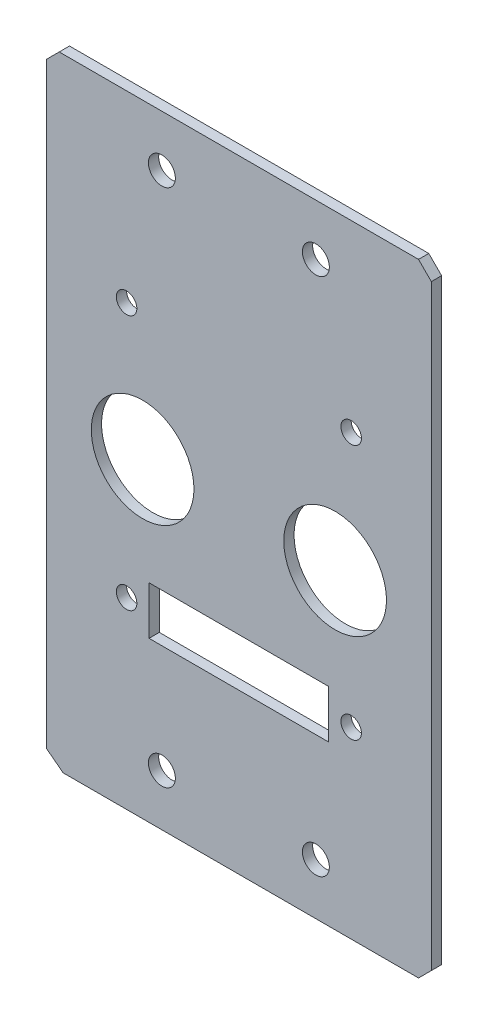
ISO-10303-21;
HEADER;
FILE_DESCRIPTION(('STEP AP214'),'2;1');
FILE_NAME('part.step','',(''),(''),'','','');
FILE_SCHEMA(('AUTOMOTIVE_DESIGN { 1 0 10303 214 1 1 1 1 }'));
ENDSEC;
DATA;
#1=APPLICATION_CONTEXT('core data for automotive mechanical design processes');
#2=APPLICATION_PROTOCOL_DEFINITION('international standard','automotive_design',2000,#1);
#3=PRODUCT_CONTEXT('',#1,'mechanical');
#4=PRODUCT('Part','Part','',(#3));
#5=PRODUCT_RELATED_PRODUCT_CATEGORY('part','',(#4));
#6=PRODUCT_DEFINITION_FORMATION('','',#4);
#7=PRODUCT_DEFINITION_CONTEXT('part definition',#1,'design');
#8=PRODUCT_DEFINITION('design','',#6,#7);
#9=PRODUCT_DEFINITION_SHAPE('','',#8);
#10=(LENGTH_UNIT() NAMED_UNIT(*) SI_UNIT(.MILLI.,.METRE.));
#11=(NAMED_UNIT(*) PLANE_ANGLE_UNIT() SI_UNIT($,.RADIAN.));
#12=(NAMED_UNIT(*) SI_UNIT($,.STERADIAN.) SOLID_ANGLE_UNIT());
#13=UNCERTAINTY_MEASURE_WITH_UNIT(LENGTH_MEASURE(1.E-05),#10,'distance_accuracy_value','');
#14=(GEOMETRIC_REPRESENTATION_CONTEXT(3) GLOBAL_UNCERTAINTY_ASSIGNED_CONTEXT((#13)) GLOBAL_UNIT_ASSIGNED_CONTEXT((#10,
#11,#12)) REPRESENTATION_CONTEXT('',''));
#15=CARTESIAN_POINT('',(0.,0.,0.));
#16=DIRECTION('',(0.,0.,1.));
#17=DIRECTION('',(1.,0.,0.));
#18=AXIS2_PLACEMENT_3D('',#15,#16,#17);
#19=CARTESIAN_POINT('',(1.07552855510562E-13,76.5000000000001,1.6));
#20=DIRECTION('',(0.,0.,-1.));
#21=DIRECTION('',(-1.,0.,0.));
#22=AXIS2_PLACEMENT_3D('',#19,#20,#21);
#23=PLANE('',#22);
#24=CARTESIAN_POINT('',(15.,0.,1.6));
#25=DIRECTION('',(0.,0.,1.));
#26=DIRECTION('',(-1.,0.,0.));
#27=AXIS2_PLACEMENT_3D('',#24,#25,#26);
#28=CIRCLE('',#27,8.);
#29=CARTESIAN_POINT('',(7.,0.,1.6));
#30=VERTEX_POINT('',#29);
#31=EDGE_CURVE('E160',#30,#30,#28,.T.);
#32=ORIENTED_EDGE('',*,*,#31,.F.);
#33=EDGE_LOOP('',(#32));
#34=FACE_BOUND('',#33,.T.);
#35=CARTESIAN_POINT('',(12.,-40.5,1.6));
#36=DIRECTION('',(0.,0.,1.));
#37=DIRECTION('',(1.,0.,0.));
#38=AXIS2_PLACEMENT_3D('',#35,#36,#37);
#39=CIRCLE('',#38,2.1);
#40=CARTESIAN_POINT('',(14.1,-40.5,1.6));
#41=VERTEX_POINT('',#40);
#42=EDGE_CURVE('E172',#41,#41,#39,.T.);
#43=ORIENTED_EDGE('',*,*,#42,.F.);
#44=EDGE_LOOP('',(#43));
#45=FACE_BOUND('',#44,.T.);
#46=CARTESIAN_POINT('',(17.5,19.9,1.6));
#47=DIRECTION('',(0.,0.,1.));
#48=DIRECTION('',(-1.,0.,0.));
#49=AXIS2_PLACEMENT_3D('',#46,#47,#48);
#50=CIRCLE('',#49,1.6);
#51=CARTESIAN_POINT('',(15.9,19.9,1.6));
#52=VERTEX_POINT('',#51);
#53=EDGE_CURVE('E184',#52,#52,#50,.T.);
#54=ORIENTED_EDGE('',*,*,#53,.F.);
#55=EDGE_LOOP('',(#54));
#56=FACE_BOUND('',#55,.T.);
#57=CARTESIAN_POINT('',(-17.5,-19.9,1.6));
#58=DIRECTION('',(0.,0.,1.));
#59=DIRECTION('',(-1.,0.,0.));
#60=AXIS2_PLACEMENT_3D('',#57,#58,#59);
#61=CIRCLE('',#60,1.6);
#62=CARTESIAN_POINT('',(-19.1,-19.9,1.6));
#63=VERTEX_POINT('',#62);
#64=EDGE_CURVE('E196',#63,#63,#61,.T.);
#65=ORIENTED_EDGE('',*,*,#64,.F.);
#66=EDGE_LOOP('',(#65));
#67=FACE_BOUND('',#66,.T.);
#68=CARTESIAN_POINT('',(-17.5,19.9,1.6));
#69=DIRECTION('',(0.,0.,1.));
#70=DIRECTION('',(1.,0.,0.));
#71=AXIS2_PLACEMENT_3D('',#68,#69,#70);
#72=CIRCLE('',#71,1.6);
#73=CARTESIAN_POINT('',(-15.9,19.9,1.6));
#74=VERTEX_POINT('',#73);
#75=EDGE_CURVE('E208',#74,#74,#72,.T.);
#76=ORIENTED_EDGE('',*,*,#75,.F.);
#77=EDGE_LOOP('',(#76));
#78=FACE_BOUND('',#77,.T.);
#79=DIRECTION('',(-0.707106781186548,-0.707106781186548,0.));
#80=VECTOR('',#79,1.);
#81=CARTESIAN_POINT('',(-30.,46.5,1.6));
#82=LINE('',#81,#80);
#83=CARTESIAN_POINT('',(-28.,48.5,1.6));
#84=VERTEX_POINT('',#83);
#85=CARTESIAN_POINT('',(-30.,46.5,1.6));
#86=VERTEX_POINT('',#85);
#87=EDGE_CURVE('E220',#84,#86,#82,.T.);
#88=ORIENTED_EDGE('',*,*,#87,.T.);
#89=DIRECTION('',(0.,-1.,0.));
#90=VECTOR('',#89,1.);
#91=CARTESIAN_POINT('',(-30.,46.5,1.6));
#92=LINE('',#91,#90);
#93=CARTESIAN_POINT('',(-30.,-46.5,1.6));
#94=VERTEX_POINT('',#93);
#95=EDGE_CURVE('E223',#86,#94,#92,.T.);
#96=ORIENTED_EDGE('',*,*,#95,.T.);
#97=DIRECTION('',(0.793797531827284,-0.608182109622531,0.));
#98=VECTOR('',#97,1.);
#99=CARTESIAN_POINT('',(-30.,-46.5,1.6));
#100=LINE('',#99,#98);
#101=CARTESIAN_POINT('',(-27.3896057800189,-48.5,1.6));
#102=VERTEX_POINT('',#101);
#103=EDGE_CURVE('E226',#94,#102,#100,.T.);
#104=ORIENTED_EDGE('',*,*,#103,.T.);
#105=DIRECTION('',(1.,0.,0.));
#106=VECTOR('',#105,1.);
#107=CARTESIAN_POINT('',(-27.3896057800189,-48.5,1.6));
#108=LINE('',#107,#106);
#109=CARTESIAN_POINT('',(28.,-48.5,1.6));
#110=VERTEX_POINT('',#109);
#111=EDGE_CURVE('E228',#102,#110,#108,.T.);
#112=ORIENTED_EDGE('',*,*,#111,.T.);
#113=DIRECTION('',(0.707106781186548,0.707106781186548,0.));
#114=VECTOR('',#113,1.);
#115=CARTESIAN_POINT('',(28.,-48.5,1.6));
#116=LINE('',#115,#114);
#117=CARTESIAN_POINT('',(30.,-46.5,1.6));
#118=VERTEX_POINT('',#117);
#119=EDGE_CURVE('E230',#110,#118,#116,.T.);
#120=ORIENTED_EDGE('',*,*,#119,.T.);
#121=DIRECTION('',(0.,1.,0.));
#122=VECTOR('',#121,1.);
#123=CARTESIAN_POINT('',(30.,46.5,1.6));
#124=LINE('',#123,#122);
#125=CARTESIAN_POINT('',(30.,46.5,1.6));
#126=VERTEX_POINT('',#125);
#127=EDGE_CURVE('E232',#118,#126,#124,.T.);
#128=ORIENTED_EDGE('',*,*,#127,.T.);
#129=DIRECTION('',(-0.707106781186545,0.70710678118655,0.));
#130=VECTOR('',#129,1.);
#131=CARTESIAN_POINT('',(28.,48.5,1.6));
#132=LINE('',#131,#130);
#133=CARTESIAN_POINT('',(28.,48.5,1.6));
#134=VERTEX_POINT('',#133);
#135=EDGE_CURVE('E234',#126,#134,#132,.T.);
#136=ORIENTED_EDGE('',*,*,#135,.T.);
#137=DIRECTION('',(-1.,0.,0.));
#138=VECTOR('',#137,1.);
#139=CARTESIAN_POINT('',(-28.,48.5,1.6));
#140=LINE('',#139,#138);
#141=EDGE_CURVE('E236',#134,#84,#140,.T.);
#142=ORIENTED_EDGE('',*,*,#141,.T.);
#143=EDGE_LOOP('',(#88,#96,#104,#112,#120,#128,#136,#142));
#144=FACE_BOUND('',#143,.T.);
#145=CARTESIAN_POINT('',(-15.,0.,1.6));
#146=DIRECTION('',(0.,0.,1.));
#147=DIRECTION('',(1.,0.,0.));
#148=AXIS2_PLACEMENT_3D('',#145,#146,#147);
#149=CIRCLE('',#148,8.);
#150=CARTESIAN_POINT('',(-6.99999999999999,0.,1.6));
#151=VERTEX_POINT('',#150);
#152=EDGE_CURVE('E214',#151,#151,#149,.T.);
#153=ORIENTED_EDGE('',*,*,#152,.F.);
#154=EDGE_LOOP('',(#153));
#155=FACE_BOUND('',#154,.T.);
#156=CARTESIAN_POINT('',(-12.,40.5,1.6));
#157=DIRECTION('',(0.,0.,1.));
#158=DIRECTION('',(1.,0.,0.));
#159=AXIS2_PLACEMENT_3D('',#156,#157,#158);
#160=CIRCLE('',#159,2.1);
#161=CARTESIAN_POINT('',(-9.9,40.5,1.6));
#162=VERTEX_POINT('',#161);
#163=EDGE_CURVE('E202',#162,#162,#160,.T.);
#164=ORIENTED_EDGE('',*,*,#163,.F.);
#165=EDGE_LOOP('',(#164));
#166=FACE_BOUND('',#165,.T.);
#167=CARTESIAN_POINT('',(-12.,-40.5,1.6));
#168=DIRECTION('',(0.,0.,1.));
#169=DIRECTION('',(-1.,0.,0.));
#170=AXIS2_PLACEMENT_3D('',#167,#168,#169);
#171=CIRCLE('',#170,2.1);
#172=CARTESIAN_POINT('',(-14.1,-40.5,1.6));
#173=VERTEX_POINT('',#172);
#174=EDGE_CURVE('E190',#173,#173,#171,.T.);
#175=ORIENTED_EDGE('',*,*,#174,.F.);
#176=EDGE_LOOP('',(#175));
#177=FACE_BOUND('',#176,.T.);
#178=CARTESIAN_POINT('',(12.,40.5,1.6));
#179=DIRECTION('',(0.,0.,1.));
#180=DIRECTION('',(-1.,0.,0.));
#181=AXIS2_PLACEMENT_3D('',#178,#179,#180);
#182=CIRCLE('',#181,2.1);
#183=CARTESIAN_POINT('',(9.90000000000003,40.5,1.6));
#184=VERTEX_POINT('',#183);
#185=EDGE_CURVE('E178',#184,#184,#182,.T.);
#186=ORIENTED_EDGE('',*,*,#185,.F.);
#187=EDGE_LOOP('',(#186));
#188=FACE_BOUND('',#187,.T.);
#189=CARTESIAN_POINT('',(17.5,-19.9,1.6));
#190=DIRECTION('',(0.,0.,1.));
#191=DIRECTION('',(1.,0.,0.));
#192=AXIS2_PLACEMENT_3D('',#189,#190,#191);
#193=CIRCLE('',#192,1.6);
#194=CARTESIAN_POINT('',(19.1,-19.9,1.6));
#195=VERTEX_POINT('',#194);
#196=EDGE_CURVE('E166',#195,#195,#193,.T.);
#197=ORIENTED_EDGE('',*,*,#196,.F.);
#198=EDGE_LOOP('',(#197));
#199=FACE_BOUND('',#198,.T.);
#200=DIRECTION('',(0.,-1.,0.));
#201=VECTOR('',#200,1.);
#202=CARTESIAN_POINT('',(-14.,-16.15,1.6));
#203=LINE('',#202,#201);
#204=CARTESIAN_POINT('',(-14.,-16.15,1.6));
#205=VERTEX_POINT('',#204);
#206=CARTESIAN_POINT('',(-14.,-23.65,1.6));
#207=VERTEX_POINT('',#206);
#208=EDGE_CURVE('E124',#205,#207,#203,.T.);
#209=ORIENTED_EDGE('',*,*,#208,.F.);
#210=DIRECTION('',(-1.,0.,0.));
#211=VECTOR('',#210,1.);
#212=CARTESIAN_POINT('',(-14.,-16.15,1.6));
#213=LINE('',#212,#211);
#214=CARTESIAN_POINT('',(14.,-16.15,1.6));
#215=VERTEX_POINT('',#214);
#216=EDGE_CURVE('E146',#215,#205,#213,.T.);
#217=ORIENTED_EDGE('',*,*,#216,.F.);
#218=DIRECTION('',(0.,1.,0.));
#219=VECTOR('',#218,1.);
#220=CARTESIAN_POINT('',(14.,-16.15,1.6));
#221=LINE('',#220,#219);
#222=CARTESIAN_POINT('',(14.,-23.65,1.6));
#223=VERTEX_POINT('',#222);
#224=EDGE_CURVE('E144',#223,#215,#221,.T.);
#225=ORIENTED_EDGE('',*,*,#224,.F.);
#226=DIRECTION('',(1.,0.,0.));
#227=VECTOR('',#226,1.);
#228=CARTESIAN_POINT('',(-14.,-23.65,1.6));
#229=LINE('',#228,#227);
#230=EDGE_CURVE('E132',#207,#223,#229,.T.);
#231=ORIENTED_EDGE('',*,*,#230,.F.);
#232=EDGE_LOOP('',(#209,#217,#225,#231));
#233=FACE_BOUND('',#232,.T.);
#234=ADVANCED_FACE('F35',(#34,#45,#56,#67,#78,#144,#155,#166,#177,#188,#199,#233),#23,.F.);
#235=CARTESIAN_POINT('',(1.07552855510562E-13,76.5000000000001,0.));
#236=DIRECTION('',(0.,0.,-1.));
#237=DIRECTION('',(-1.,0.,0.));
#238=AXIS2_PLACEMENT_3D('',#235,#236,#237);
#239=PLANE('',#238);
#240=CARTESIAN_POINT('',(15.,0.,0.));
#241=DIRECTION('',(0.,0.,1.));
#242=DIRECTION('',(-1.,0.,0.));
#243=AXIS2_PLACEMENT_3D('',#240,#241,#242);
#244=CIRCLE('',#243,8.);
#245=CARTESIAN_POINT('',(7.,0.,0.));
#246=VERTEX_POINT('',#245);
#247=EDGE_CURVE('E140',#246,#246,#244,.T.);
#248=ORIENTED_EDGE('',*,*,#247,.T.);
#249=EDGE_LOOP('',(#248));
#250=FACE_BOUND('',#249,.T.);
#251=CARTESIAN_POINT('',(12.,-40.5,0.));
#252=DIRECTION('',(0.,0.,1.));
#253=DIRECTION('',(1.,0.,0.));
#254=AXIS2_PLACEMENT_3D('',#251,#252,#253);
#255=CIRCLE('',#254,2.1);
#256=CARTESIAN_POINT('',(14.1,-40.5,0.));
#257=VERTEX_POINT('',#256);
#258=EDGE_CURVE('E169',#257,#257,#255,.T.);
#259=ORIENTED_EDGE('',*,*,#258,.T.);
#260=EDGE_LOOP('',(#259));
#261=FACE_BOUND('',#260,.T.);
#262=CARTESIAN_POINT('',(17.5,19.9,0.));
#263=DIRECTION('',(0.,0.,1.));
#264=DIRECTION('',(-1.,0.,0.));
#265=AXIS2_PLACEMENT_3D('',#262,#263,#264);
#266=CIRCLE('',#265,1.6);
#267=CARTESIAN_POINT('',(15.9,19.9,0.));
#268=VERTEX_POINT('',#267);
#269=EDGE_CURVE('E181',#268,#268,#266,.T.);
#270=ORIENTED_EDGE('',*,*,#269,.T.);
#271=EDGE_LOOP('',(#270));
#272=FACE_BOUND('',#271,.T.);
#273=CARTESIAN_POINT('',(-17.5,-19.9,0.));
#274=DIRECTION('',(0.,0.,1.));
#275=DIRECTION('',(-1.,0.,0.));
#276=AXIS2_PLACEMENT_3D('',#273,#274,#275);
#277=CIRCLE('',#276,1.6);
#278=CARTESIAN_POINT('',(-19.1,-19.9,0.));
#279=VERTEX_POINT('',#278);
#280=EDGE_CURVE('E193',#279,#279,#277,.T.);
#281=ORIENTED_EDGE('',*,*,#280,.T.);
#282=EDGE_LOOP('',(#281));
#283=FACE_BOUND('',#282,.T.);
#284=CARTESIAN_POINT('',(-17.5,19.9,0.));
#285=DIRECTION('',(0.,0.,1.));
#286=DIRECTION('',(1.,0.,0.));
#287=AXIS2_PLACEMENT_3D('',#284,#285,#286);
#288=CIRCLE('',#287,1.6);
#289=CARTESIAN_POINT('',(-15.9,19.9,0.));
#290=VERTEX_POINT('',#289);
#291=EDGE_CURVE('E205',#290,#290,#288,.T.);
#292=ORIENTED_EDGE('',*,*,#291,.T.);
#293=EDGE_LOOP('',(#292));
#294=FACE_BOUND('',#293,.T.);
#295=DIRECTION('',(-0.707106781186548,-0.707106781186548,0.));
#296=VECTOR('',#295,1.);
#297=CARTESIAN_POINT('',(-30.,46.5,0.));
#298=LINE('',#297,#296);
#299=CARTESIAN_POINT('',(-28.,48.5,0.));
#300=VERTEX_POINT('',#299);
#301=CARTESIAN_POINT('',(-30.,46.5,0.));
#302=VERTEX_POINT('',#301);
#303=EDGE_CURVE('E217',#300,#302,#298,.T.);
#304=ORIENTED_EDGE('',*,*,#303,.F.);
#305=DIRECTION('',(-1.,0.,0.));
#306=VECTOR('',#305,1.);
#307=CARTESIAN_POINT('',(-28.,48.5,0.));
#308=LINE('',#307,#306);
#309=CARTESIAN_POINT('',(28.,48.5,0.));
#310=VERTEX_POINT('',#309);
#311=EDGE_CURVE('E224',#310,#300,#308,.T.);
#312=ORIENTED_EDGE('',*,*,#311,.F.);
#313=DIRECTION('',(-0.707106781186545,0.70710678118655,0.));
#314=VECTOR('',#313,1.);
#315=CARTESIAN_POINT('',(28.,48.5,0.));
#316=LINE('',#315,#314);
#317=CARTESIAN_POINT('',(30.,46.5,0.));
#318=VERTEX_POINT('',#317);
#319=EDGE_CURVE('E251',#318,#310,#316,.T.);
#320=ORIENTED_EDGE('',*,*,#319,.F.);
#321=DIRECTION('',(0.,1.,0.));
#322=VECTOR('',#321,1.);
#323=CARTESIAN_POINT('',(30.,46.5,0.));
#324=LINE('',#323,#322);
#325=CARTESIAN_POINT('',(30.,-46.5,0.));
#326=VERTEX_POINT('',#325);
#327=EDGE_CURVE('E249',#326,#318,#324,.T.);
#328=ORIENTED_EDGE('',*,*,#327,.F.);
#329=DIRECTION('',(0.707106781186548,0.707106781186548,0.));
#330=VECTOR('',#329,1.);
#331=CARTESIAN_POINT('',(28.,-48.5,0.));
#332=LINE('',#331,#330);
#333=CARTESIAN_POINT('',(28.,-48.5,0.));
#334=VERTEX_POINT('',#333);
#335=EDGE_CURVE('E247',#334,#326,#332,.T.);
#336=ORIENTED_EDGE('',*,*,#335,.F.);
#337=DIRECTION('',(1.,0.,0.));
#338=VECTOR('',#337,1.);
#339=CARTESIAN_POINT('',(-27.3896057800189,-48.5,0.));
#340=LINE('',#339,#338);
#341=CARTESIAN_POINT('',(-27.3896057800189,-48.5,0.));
#342=VERTEX_POINT('',#341);
#343=EDGE_CURVE('E245',#342,#334,#340,.T.);
#344=ORIENTED_EDGE('',*,*,#343,.F.);
#345=DIRECTION('',(0.793797531827284,-0.608182109622531,0.));
#346=VECTOR('',#345,1.);
#347=CARTESIAN_POINT('',(-30.,-46.5,0.));
#348=LINE('',#347,#346);
#349=CARTESIAN_POINT('',(-30.,-46.5,0.));
#350=VERTEX_POINT('',#349);
#351=EDGE_CURVE('E243',#350,#342,#348,.T.);
#352=ORIENTED_EDGE('',*,*,#351,.F.);
#353=DIRECTION('',(0.,-1.,0.));
#354=VECTOR('',#353,1.);
#355=CARTESIAN_POINT('',(-30.,46.5,0.));
#356=LINE('',#355,#354);
#357=EDGE_CURVE('E241',#302,#350,#356,.T.);
#358=ORIENTED_EDGE('',*,*,#357,.F.);
#359=EDGE_LOOP('',(#304,#312,#320,#328,#336,#344,#352,#358));
#360=FACE_BOUND('',#359,.T.);
#361=CARTESIAN_POINT('',(-15.,0.,0.));
#362=DIRECTION('',(0.,0.,1.));
#363=DIRECTION('',(1.,0.,0.));
#364=AXIS2_PLACEMENT_3D('',#361,#362,#363);
#365=CIRCLE('',#364,8.);
#366=CARTESIAN_POINT('',(-6.99999999999999,0.,0.));
#367=VERTEX_POINT('',#366);
#368=EDGE_CURVE('E211',#367,#367,#365,.T.);
#369=ORIENTED_EDGE('',*,*,#368,.T.);
#370=EDGE_LOOP('',(#369));
#371=FACE_BOUND('',#370,.T.);
#372=CARTESIAN_POINT('',(-12.,40.5,0.));
#373=DIRECTION('',(0.,0.,1.));
#374=DIRECTION('',(1.,0.,0.));
#375=AXIS2_PLACEMENT_3D('',#372,#373,#374);
#376=CIRCLE('',#375,2.1);
#377=CARTESIAN_POINT('',(-9.9,40.5,0.));
#378=VERTEX_POINT('',#377);
#379=EDGE_CURVE('E199',#378,#378,#376,.T.);
#380=ORIENTED_EDGE('',*,*,#379,.T.);
#381=EDGE_LOOP('',(#380));
#382=FACE_BOUND('',#381,.T.);
#383=CARTESIAN_POINT('',(-12.,-40.5,0.));
#384=DIRECTION('',(0.,0.,1.));
#385=DIRECTION('',(-1.,0.,0.));
#386=AXIS2_PLACEMENT_3D('',#383,#384,#385);
#387=CIRCLE('',#386,2.1);
#388=CARTESIAN_POINT('',(-14.1,-40.5,0.));
#389=VERTEX_POINT('',#388);
#390=EDGE_CURVE('E187',#389,#389,#387,.T.);
#391=ORIENTED_EDGE('',*,*,#390,.T.);
#392=EDGE_LOOP('',(#391));
#393=FACE_BOUND('',#392,.T.);
#394=CARTESIAN_POINT('',(12.,40.5,0.));
#395=DIRECTION('',(0.,0.,1.));
#396=DIRECTION('',(-1.,0.,0.));
#397=AXIS2_PLACEMENT_3D('',#394,#395,#396);
#398=CIRCLE('',#397,2.1);
#399=CARTESIAN_POINT('',(9.90000000000003,40.5,0.));
#400=VERTEX_POINT('',#399);
#401=EDGE_CURVE('E175',#400,#400,#398,.T.);
#402=ORIENTED_EDGE('',*,*,#401,.T.);
#403=EDGE_LOOP('',(#402));
#404=FACE_BOUND('',#403,.T.);
#405=CARTESIAN_POINT('',(17.5,-19.9,0.));
#406=DIRECTION('',(0.,0.,1.));
#407=DIRECTION('',(1.,0.,0.));
#408=AXIS2_PLACEMENT_3D('',#405,#406,#407);
#409=CIRCLE('',#408,1.6);
#410=CARTESIAN_POINT('',(19.1,-19.9,0.));
#411=VERTEX_POINT('',#410);
#412=EDGE_CURVE('E163',#411,#411,#409,.T.);
#413=ORIENTED_EDGE('',*,*,#412,.T.);
#414=EDGE_LOOP('',(#413));
#415=FACE_BOUND('',#414,.T.);
#416=DIRECTION('',(-1.,0.,0.));
#417=VECTOR('',#416,1.);
#418=CARTESIAN_POINT('',(-14.,-16.15,0.));
#419=LINE('',#418,#417);
#420=CARTESIAN_POINT('',(14.,-16.15,0.));
#421=VERTEX_POINT('',#420);
#422=CARTESIAN_POINT('',(-14.,-16.15,0.));
#423=VERTEX_POINT('',#422);
#424=EDGE_CURVE('E133',#421,#423,#419,.T.);
#425=ORIENTED_EDGE('',*,*,#424,.T.);
#426=DIRECTION('',(0.,-1.,0.));
#427=VECTOR('',#426,1.);
#428=CARTESIAN_POINT('',(-14.,-16.15,0.));
#429=LINE('',#428,#427);
#430=CARTESIAN_POINT('',(-14.,-23.65,0.));
#431=VERTEX_POINT('',#430);
#432=EDGE_CURVE('E58',#423,#431,#429,.T.);
#433=ORIENTED_EDGE('',*,*,#432,.T.);
#434=DIRECTION('',(1.,0.,0.));
#435=VECTOR('',#434,1.);
#436=CARTESIAN_POINT('',(-14.,-23.65,0.));
#437=LINE('',#436,#435);
#438=CARTESIAN_POINT('',(14.,-23.65,0.));
#439=VERTEX_POINT('',#438);
#440=EDGE_CURVE('E139',#431,#439,#437,.T.);
#441=ORIENTED_EDGE('',*,*,#440,.T.);
#442=DIRECTION('',(0.,1.,0.));
#443=VECTOR('',#442,1.);
#444=CARTESIAN_POINT('',(14.,-16.15,0.));
#445=LINE('',#444,#443);
#446=EDGE_CURVE('E152',#439,#421,#445,.T.);
#447=ORIENTED_EDGE('',*,*,#446,.T.);
#448=EDGE_LOOP('',(#425,#433,#441,#447));
#449=FACE_BOUND('',#448,.T.);
#450=ADVANCED_FACE('F281',(#250,#261,#272,#283,#294,#360,#371,#382,#393,#404,#415,#449),#239,.T.);
#451=CARTESIAN_POINT('',(-30.,46.5,1.6));
#452=DIRECTION('',(0.707106781186548,-0.707106781186548,0.));
#453=DIRECTION('',(0.707106781186548,0.707106781186548,0.));
#454=AXIS2_PLACEMENT_3D('',#451,#452,#453);
#455=PLANE('',#454);
#456=ORIENTED_EDGE('',*,*,#303,.T.);
#457=DIRECTION('',(0.,0.,-1.));
#458=VECTOR('',#457,1.);
#459=CARTESIAN_POINT('',(-30.,46.5,1.6));
#460=LINE('',#459,#458);
#461=EDGE_CURVE('E11',#86,#302,#460,.T.);
#462=ORIENTED_EDGE('',*,*,#461,.F.);
#463=ORIENTED_EDGE('',*,*,#87,.F.);
#464=DIRECTION('',(0.,0.,-1.));
#465=VECTOR('',#464,1.);
#466=CARTESIAN_POINT('',(-28.,48.5,1.6));
#467=LINE('',#466,#465);
#468=EDGE_CURVE('E238',#84,#300,#467,.T.);
#469=ORIENTED_EDGE('',*,*,#468,.T.);
#470=EDGE_LOOP('',(#456,#462,#463,#469));
#471=FACE_BOUND('',#470,.T.);
#472=ADVANCED_FACE('F37',(#471),#455,.F.);
#473=CARTESIAN_POINT('',(-30.,46.5,1.6));
#474=DIRECTION('',(1.,0.,0.));
#475=DIRECTION('',(0.,1.,0.));
#476=AXIS2_PLACEMENT_3D('',#473,#474,#475);
#477=PLANE('',#476);
#478=ORIENTED_EDGE('',*,*,#357,.T.);
#479=DIRECTION('',(0.,0.,-1.));
#480=VECTOR('',#479,1.);
#481=CARTESIAN_POINT('',(-30.,-46.5,1.6));
#482=LINE('',#481,#480);
#483=EDGE_CURVE('E43',#94,#350,#482,.T.);
#484=ORIENTED_EDGE('',*,*,#483,.F.);
#485=ORIENTED_EDGE('',*,*,#95,.F.);
#486=ORIENTED_EDGE('',*,*,#461,.T.);
#487=EDGE_LOOP('',(#478,#484,#485,#486));
#488=FACE_BOUND('',#487,.T.);
#489=ADVANCED_FACE('F299',(#488),#477,.F.);
#490=CARTESIAN_POINT('',(-30.,-46.5,1.6));
#491=DIRECTION('',(0.608182109622531,0.793797531827284,0.));
#492=DIRECTION('',(-0.793797531827284,0.608182109622531,0.));
#493=AXIS2_PLACEMENT_3D('',#490,#491,#492);
#494=PLANE('',#493);
#495=ORIENTED_EDGE('',*,*,#351,.T.);
#496=DIRECTION('',(0.,0.,-1.));
#497=VECTOR('',#496,1.);
#498=CARTESIAN_POINT('',(-27.3896057800189,-48.5,1.6));
#499=LINE('',#498,#497);
#500=EDGE_CURVE('E268',#102,#342,#499,.T.);
#501=ORIENTED_EDGE('',*,*,#500,.F.);
#502=ORIENTED_EDGE('',*,*,#103,.F.);
#503=ORIENTED_EDGE('',*,*,#483,.T.);
#504=EDGE_LOOP('',(#495,#501,#502,#503));
#505=FACE_BOUND('',#504,.T.);
#506=ADVANCED_FACE('F275',(#505),#494,.F.);
#507=CARTESIAN_POINT('',(-27.3896057800189,-48.5,1.6));
#508=DIRECTION('',(0.,1.,0.));
#509=DIRECTION('',(-1.,0.,0.));
#510=AXIS2_PLACEMENT_3D('',#507,#508,#509);
#511=PLANE('',#510);
#512=ORIENTED_EDGE('',*,*,#343,.T.);
#513=DIRECTION('',(0.,0.,-1.));
#514=VECTOR('',#513,1.);
#515=CARTESIAN_POINT('',(28.,-48.5,1.6));
#516=LINE('',#515,#514);
#517=EDGE_CURVE('E265',#110,#334,#516,.T.);
#518=ORIENTED_EDGE('',*,*,#517,.F.);
#519=ORIENTED_EDGE('',*,*,#111,.F.);
#520=ORIENTED_EDGE('',*,*,#500,.T.);
#521=EDGE_LOOP('',(#512,#518,#519,#520));
#522=FACE_BOUND('',#521,.T.);
#523=ADVANCED_FACE('F287',(#522),#511,.F.);
#524=CARTESIAN_POINT('',(28.,-48.5,1.6));
#525=DIRECTION('',(-0.707106781186548,0.707106781186548,0.));
#526=DIRECTION('',(-0.707106781186548,-0.707106781186548,0.));
#527=AXIS2_PLACEMENT_3D('',#524,#525,#526);
#528=PLANE('',#527);
#529=ORIENTED_EDGE('',*,*,#335,.T.);
#530=DIRECTION('',(0.,0.,-1.));
#531=VECTOR('',#530,1.);
#532=CARTESIAN_POINT('',(30.,-46.5,1.6));
#533=LINE('',#532,#531);
#534=EDGE_CURVE('E262',#118,#326,#533,.T.);
#535=ORIENTED_EDGE('',*,*,#534,.F.);
#536=ORIENTED_EDGE('',*,*,#119,.F.);
#537=ORIENTED_EDGE('',*,*,#517,.T.);
#538=EDGE_LOOP('',(#529,#535,#536,#537));
#539=FACE_BOUND('',#538,.T.);
#540=ADVANCED_FACE('F291',(#539),#528,.F.);
#541=CARTESIAN_POINT('',(30.,46.5,1.6));
#542=DIRECTION('',(-1.,0.,0.));
#543=DIRECTION('',(0.,-1.,0.));
#544=AXIS2_PLACEMENT_3D('',#541,#542,#543);
#545=PLANE('',#544);
#546=ORIENTED_EDGE('',*,*,#327,.T.);
#547=DIRECTION('',(0.,0.,-1.));
#548=VECTOR('',#547,1.);
#549=CARTESIAN_POINT('',(30.,46.5,1.6));
#550=LINE('',#549,#548);
#551=EDGE_CURVE('E259',#126,#318,#550,.T.);
#552=ORIENTED_EDGE('',*,*,#551,.F.);
#553=ORIENTED_EDGE('',*,*,#127,.F.);
#554=ORIENTED_EDGE('',*,*,#534,.T.);
#555=EDGE_LOOP('',(#546,#552,#553,#554));
#556=FACE_BOUND('',#555,.T.);
#557=ADVANCED_FACE('F312',(#556),#545,.F.);
#558=CARTESIAN_POINT('',(28.,48.5,1.6));
#559=DIRECTION('',(-0.70710678118655,-0.707106781186545,0.));
#560=DIRECTION('',(0.707106781186545,-0.70710678118655,0.));
#561=AXIS2_PLACEMENT_3D('',#558,#559,#560);
#562=PLANE('',#561);
#563=ORIENTED_EDGE('',*,*,#319,.T.);
#564=DIRECTION('',(0.,0.,-1.));
#565=VECTOR('',#564,1.);
#566=CARTESIAN_POINT('',(28.,48.5,1.6));
#567=LINE('',#566,#565);
#568=EDGE_CURVE('E256',#134,#310,#567,.T.);
#569=ORIENTED_EDGE('',*,*,#568,.F.);
#570=ORIENTED_EDGE('',*,*,#135,.F.);
#571=ORIENTED_EDGE('',*,*,#551,.T.);
#572=EDGE_LOOP('',(#563,#569,#570,#571));
#573=FACE_BOUND('',#572,.T.);
#574=ADVANCED_FACE('F310',(#573),#562,.F.);
#575=CARTESIAN_POINT('',(-28.,48.5,1.6));
#576=DIRECTION('',(0.,-1.,0.));
#577=DIRECTION('',(1.,0.,0.));
#578=AXIS2_PLACEMENT_3D('',#575,#576,#577);
#579=PLANE('',#578);
#580=ORIENTED_EDGE('',*,*,#311,.T.);
#581=ORIENTED_EDGE('',*,*,#468,.F.);
#582=ORIENTED_EDGE('',*,*,#141,.F.);
#583=ORIENTED_EDGE('',*,*,#568,.T.);
#584=EDGE_LOOP('',(#580,#581,#582,#583));
#585=FACE_BOUND('',#584,.T.);
#586=ADVANCED_FACE('F305',(#585),#579,.F.);
#587=CARTESIAN_POINT('',(-15.,0.,1.6));
#588=DIRECTION('',(0.,0.,-1.));
#589=DIRECTION('',(-1.,0.,0.));
#590=AXIS2_PLACEMENT_3D('',#587,#588,#589);
#591=CYLINDRICAL_SURFACE('',#590,8.);
#592=ORIENTED_EDGE('',*,*,#152,.T.);
#593=EDGE_LOOP('',(#592));
#594=FACE_BOUND('',#593,.T.);
#595=ORIENTED_EDGE('',*,*,#368,.F.);
#596=EDGE_LOOP('',(#595));
#597=FACE_BOUND('',#596,.T.);
#598=ADVANCED_FACE('F332',(#594,#597),#591,.F.);
#599=CARTESIAN_POINT('',(-17.5,19.9,1.6));
#600=DIRECTION('',(0.,0.,-1.));
#601=DIRECTION('',(-1.,0.,0.));
#602=AXIS2_PLACEMENT_3D('',#599,#600,#601);
#603=CYLINDRICAL_SURFACE('',#602,1.6);
#604=ORIENTED_EDGE('',*,*,#75,.T.);
#605=EDGE_LOOP('',(#604));
#606=FACE_BOUND('',#605,.T.);
#607=ORIENTED_EDGE('',*,*,#291,.F.);
#608=EDGE_LOOP('',(#607));
#609=FACE_BOUND('',#608,.T.);
#610=ADVANCED_FACE('F339',(#606,#609),#603,.F.);
#611=CARTESIAN_POINT('',(-12.,40.5,1.6));
#612=DIRECTION('',(0.,0.,-1.));
#613=DIRECTION('',(-1.,0.,0.));
#614=AXIS2_PLACEMENT_3D('',#611,#612,#613);
#615=CYLINDRICAL_SURFACE('',#614,2.1);
#616=ORIENTED_EDGE('',*,*,#163,.T.);
#617=EDGE_LOOP('',(#616));
#618=FACE_BOUND('',#617,.T.);
#619=ORIENTED_EDGE('',*,*,#379,.F.);
#620=EDGE_LOOP('',(#619));
#621=FACE_BOUND('',#620,.T.);
#622=ADVANCED_FACE('F344',(#618,#621),#615,.F.);
#623=CARTESIAN_POINT('',(-17.5,-19.9,1.6));
#624=DIRECTION('',(0.,0.,-1.));
#625=DIRECTION('',(-1.,0.,0.));
#626=AXIS2_PLACEMENT_3D('',#623,#624,#625);
#627=CYLINDRICAL_SURFACE('',#626,1.6);
#628=ORIENTED_EDGE('',*,*,#64,.T.);
#629=EDGE_LOOP('',(#628));
#630=FACE_BOUND('',#629,.T.);
#631=ORIENTED_EDGE('',*,*,#280,.F.);
#632=EDGE_LOOP('',(#631));
#633=FACE_BOUND('',#632,.T.);
#634=ADVANCED_FACE('F396',(#630,#633),#627,.F.);
#635=CARTESIAN_POINT('',(-12.,-40.5,1.6));
#636=DIRECTION('',(0.,0.,-1.));
#637=DIRECTION('',(-1.,0.,0.));
#638=AXIS2_PLACEMENT_3D('',#635,#636,#637);
#639=CYLINDRICAL_SURFACE('',#638,2.1);
#640=ORIENTED_EDGE('',*,*,#174,.T.);
#641=EDGE_LOOP('',(#640));
#642=FACE_BOUND('',#641,.T.);
#643=ORIENTED_EDGE('',*,*,#390,.F.);
#644=EDGE_LOOP('',(#643));
#645=FACE_BOUND('',#644,.T.);
#646=ADVANCED_FACE('F392',(#642,#645),#639,.F.);
#647=CARTESIAN_POINT('',(17.5,19.9,1.6));
#648=DIRECTION('',(0.,0.,-1.));
#649=DIRECTION('',(-1.,0.,0.));
#650=AXIS2_PLACEMENT_3D('',#647,#648,#649);
#651=CYLINDRICAL_SURFACE('',#650,1.6);
#652=ORIENTED_EDGE('',*,*,#53,.T.);
#653=EDGE_LOOP('',(#652));
#654=FACE_BOUND('',#653,.T.);
#655=ORIENTED_EDGE('',*,*,#269,.F.);
#656=EDGE_LOOP('',(#655));
#657=FACE_BOUND('',#656,.T.);
#658=ADVANCED_FACE('F388',(#654,#657),#651,.F.);
#659=CARTESIAN_POINT('',(12.,40.5,1.6));
#660=DIRECTION('',(0.,0.,-1.));
#661=DIRECTION('',(-1.,0.,0.));
#662=AXIS2_PLACEMENT_3D('',#659,#660,#661);
#663=CYLINDRICAL_SURFACE('',#662,2.1);
#664=ORIENTED_EDGE('',*,*,#185,.T.);
#665=EDGE_LOOP('',(#664));
#666=FACE_BOUND('',#665,.T.);
#667=ORIENTED_EDGE('',*,*,#401,.F.);
#668=EDGE_LOOP('',(#667));
#669=FACE_BOUND('',#668,.T.);
#670=ADVANCED_FACE('F384',(#666,#669),#663,.F.);
#671=CARTESIAN_POINT('',(12.,-40.5,1.6));
#672=DIRECTION('',(0.,0.,-1.));
#673=DIRECTION('',(-1.,0.,0.));
#674=AXIS2_PLACEMENT_3D('',#671,#672,#673);
#675=CYLINDRICAL_SURFACE('',#674,2.1);
#676=ORIENTED_EDGE('',*,*,#42,.T.);
#677=EDGE_LOOP('',(#676));
#678=FACE_BOUND('',#677,.T.);
#679=ORIENTED_EDGE('',*,*,#258,.F.);
#680=EDGE_LOOP('',(#679));
#681=FACE_BOUND('',#680,.T.);
#682=ADVANCED_FACE('F380',(#678,#681),#675,.F.);
#683=CARTESIAN_POINT('',(17.5,-19.9,1.6));
#684=DIRECTION('',(0.,0.,-1.));
#685=DIRECTION('',(-1.,0.,0.));
#686=AXIS2_PLACEMENT_3D('',#683,#684,#685);
#687=CYLINDRICAL_SURFACE('',#686,1.6);
#688=ORIENTED_EDGE('',*,*,#196,.T.);
#689=EDGE_LOOP('',(#688));
#690=FACE_BOUND('',#689,.T.);
#691=ORIENTED_EDGE('',*,*,#412,.F.);
#692=EDGE_LOOP('',(#691));
#693=FACE_BOUND('',#692,.T.);
#694=ADVANCED_FACE('F376',(#690,#693),#687,.F.);
#695=CARTESIAN_POINT('',(15.,0.,1.6));
#696=DIRECTION('',(0.,0.,-1.));
#697=DIRECTION('',(-1.,0.,0.));
#698=AXIS2_PLACEMENT_3D('',#695,#696,#697);
#699=CYLINDRICAL_SURFACE('',#698,8.);
#700=ORIENTED_EDGE('',*,*,#31,.T.);
#701=EDGE_LOOP('',(#700));
#702=FACE_BOUND('',#701,.T.);
#703=ORIENTED_EDGE('',*,*,#247,.F.);
#704=EDGE_LOOP('',(#703));
#705=FACE_BOUND('',#704,.T.);
#706=ADVANCED_FACE('F373',(#702,#705),#699,.F.);
#707=CARTESIAN_POINT('',(-14.,-16.15,1.6));
#708=DIRECTION('',(1.,0.,0.));
#709=DIRECTION('',(0.,1.,0.));
#710=AXIS2_PLACEMENT_3D('',#707,#708,#709);
#711=PLANE('',#710);
#712=ORIENTED_EDGE('',*,*,#432,.F.);
#713=DIRECTION('',(0.,0.,-1.));
#714=VECTOR('',#713,1.);
#715=CARTESIAN_POINT('',(-14.,-16.15,1.6));
#716=LINE('',#715,#714);
#717=EDGE_CURVE('E128',#205,#423,#716,.T.);
#718=ORIENTED_EDGE('',*,*,#717,.F.);
#719=ORIENTED_EDGE('',*,*,#208,.T.);
#720=DIRECTION('',(0.,0.,-1.));
#721=VECTOR('',#720,1.);
#722=CARTESIAN_POINT('',(-14.,-23.65,1.6));
#723=LINE('',#722,#721);
#724=EDGE_CURVE('E127',#207,#431,#723,.T.);
#725=ORIENTED_EDGE('',*,*,#724,.T.);
#726=EDGE_LOOP('',(#712,#718,#719,#725));
#727=FACE_BOUND('',#726,.T.);
#728=ADVANCED_FACE('F126',(#727),#711,.T.);
#729=CARTESIAN_POINT('',(-14.,-23.65,1.6));
#730=DIRECTION('',(0.,1.,0.));
#731=DIRECTION('',(-1.,0.,0.));
#732=AXIS2_PLACEMENT_3D('',#729,#730,#731);
#733=PLANE('',#732);
#734=ORIENTED_EDGE('',*,*,#440,.F.);
#735=ORIENTED_EDGE('',*,*,#724,.F.);
#736=ORIENTED_EDGE('',*,*,#230,.T.);
#737=DIRECTION('',(0.,0.,-1.));
#738=VECTOR('',#737,1.);
#739=CARTESIAN_POINT('',(14.,-23.65,1.6));
#740=LINE('',#739,#738);
#741=EDGE_CURVE('E141',#223,#439,#740,.T.);
#742=ORIENTED_EDGE('',*,*,#741,.T.);
#743=EDGE_LOOP('',(#734,#735,#736,#742));
#744=FACE_BOUND('',#743,.T.);
#745=ADVANCED_FACE('F136',(#744),#733,.T.);
#746=CARTESIAN_POINT('',(14.,-16.15,1.6));
#747=DIRECTION('',(-1.,0.,0.));
#748=DIRECTION('',(0.,-1.,0.));
#749=AXIS2_PLACEMENT_3D('',#746,#747,#748);
#750=PLANE('',#749);
#751=ORIENTED_EDGE('',*,*,#446,.F.);
#752=ORIENTED_EDGE('',*,*,#741,.F.);
#753=ORIENTED_EDGE('',*,*,#224,.T.);
#754=DIRECTION('',(0.,0.,-1.));
#755=VECTOR('',#754,1.);
#756=CARTESIAN_POINT('',(14.,-16.15,1.6));
#757=LINE('',#756,#755);
#758=EDGE_CURVE('E50',#215,#421,#757,.T.);
#759=ORIENTED_EDGE('',*,*,#758,.T.);
#760=EDGE_LOOP('',(#751,#752,#753,#759));
#761=FACE_BOUND('',#760,.T.);
#762=ADVANCED_FACE('F361',(#761),#750,.T.);
#763=CARTESIAN_POINT('',(-14.,-16.15,1.6));
#764=DIRECTION('',(0.,-1.,0.));
#765=DIRECTION('',(0.,0.,-1.));
#766=AXIS2_PLACEMENT_3D('',#763,#764,#765);
#767=PLANE('',#766);
#768=ORIENTED_EDGE('',*,*,#424,.F.);
#769=ORIENTED_EDGE('',*,*,#758,.F.);
#770=ORIENTED_EDGE('',*,*,#216,.T.);
#771=ORIENTED_EDGE('',*,*,#717,.T.);
#772=EDGE_LOOP('',(#768,#769,#770,#771));
#773=FACE_BOUND('',#772,.T.);
#774=ADVANCED_FACE('F359',(#773),#767,.T.);
#775=CLOSED_SHELL('',(#234,#450,#472,#489,#506,#523,#540,#557,#574,#586,#598,#610,#622,#634,
#646,#658,#670,#682,#694,#706,#728,#745,#762,#774));
#776=MANIFOLD_SOLID_BREP('B2',#775);
#777=ADVANCED_BREP_SHAPE_REPRESENTATION('',(#18,#776),#14);
#778=SHAPE_DEFINITION_REPRESENTATION(#9,#777);
ENDSEC;
END-ISO-10303-21;
